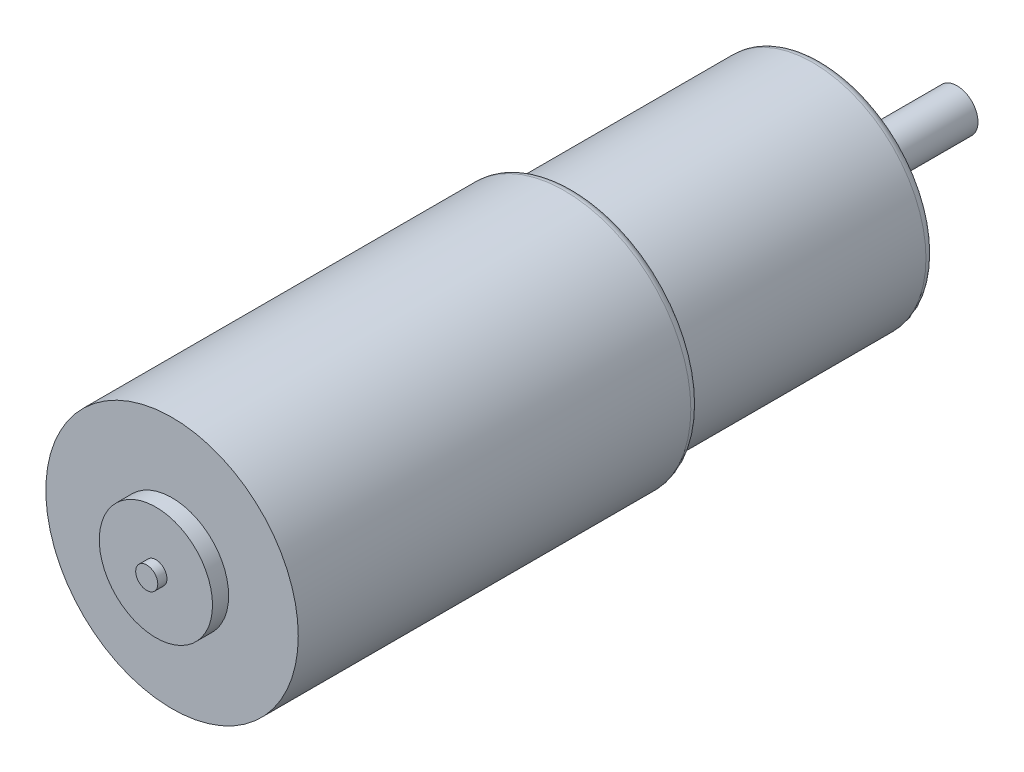
ISO-10303-21;
HEADER;
FILE_DESCRIPTION(('STEP AP214'),'2;1');
FILE_NAME('part.step','',(''),(''),'','','');
FILE_SCHEMA(('AUTOMOTIVE_DESIGN { 1 0 10303 214 1 1 1 1 }'));
ENDSEC;
DATA;
#1=APPLICATION_CONTEXT('core data for automotive mechanical design processes');
#2=APPLICATION_PROTOCOL_DEFINITION('international standard','automotive_design',2000,#1);
#3=PRODUCT_CONTEXT('',#1,'mechanical');
#4=PRODUCT('Part','Part','',(#3));
#5=PRODUCT_RELATED_PRODUCT_CATEGORY('part','',(#4));
#6=PRODUCT_DEFINITION_FORMATION('','',#4);
#7=PRODUCT_DEFINITION_CONTEXT('part definition',#1,'design');
#8=PRODUCT_DEFINITION('design','',#6,#7);
#9=PRODUCT_DEFINITION_SHAPE('','',#8);
#10=(LENGTH_UNIT() NAMED_UNIT(*) SI_UNIT(.MILLI.,.METRE.));
#11=(NAMED_UNIT(*) PLANE_ANGLE_UNIT() SI_UNIT($,.RADIAN.));
#12=(NAMED_UNIT(*) SI_UNIT($,.STERADIAN.) SOLID_ANGLE_UNIT());
#13=UNCERTAINTY_MEASURE_WITH_UNIT(LENGTH_MEASURE(1.E-05),#10,'distance_accuracy_value','');
#14=(GEOMETRIC_REPRESENTATION_CONTEXT(3) GLOBAL_UNCERTAINTY_ASSIGNED_CONTEXT((#13)) GLOBAL_UNIT_ASSIGNED_CONTEXT((#10,
#11,#12)) REPRESENTATION_CONTEXT('',''));
#15=CARTESIAN_POINT('',(0.,0.,0.));
#16=DIRECTION('',(0.,0.,1.));
#17=DIRECTION('',(1.,0.,0.));
#18=AXIS2_PLACEMENT_3D('',#15,#16,#17);
#19=CARTESIAN_POINT('',(0.,0.,-111.125));
#20=DIRECTION('',(0.,0.,1.));
#21=DIRECTION('',(1.,0.,0.));
#22=AXIS2_PLACEMENT_3D('',#19,#20,#21);
#23=PLANE('',#22);
#24=CARTESIAN_POINT('',(0.,0.,-111.125));
#25=DIRECTION('',(0.,0.,1.));
#26=DIRECTION('',(1.,0.,0.));
#27=AXIS2_PLACEMENT_3D('',#24,#25,#26);
#28=CIRCLE('',#27,2.9718);
#29=CARTESIAN_POINT('',(2.9718,0.,-111.125));
#30=VERTEX_POINT('',#29);
#31=EDGE_CURVE('E11',#30,#30,#28,.T.);
#32=ORIENTED_EDGE('',*,*,#31,.F.);
#33=EDGE_LOOP('',(#32));
#34=FACE_BOUND('',#33,.T.);
#35=ADVANCED_FACE('F34',(#34),#23,.F.);
#36=CARTESIAN_POINT('',(0.,0.,3.5814));
#37=DIRECTION('',(0.,0.,1.));
#38=DIRECTION('',(1.,0.,0.));
#39=AXIS2_PLACEMENT_3D('',#36,#37,#38);
#40=CYLINDRICAL_SURFACE('',#39,2.9718);
#41=CARTESIAN_POINT('',(0.,0.,-94.9452));
#42=DIRECTION('',(0.,0.,1.));
#43=DIRECTION('',(1.,0.,0.));
#44=AXIS2_PLACEMENT_3D('',#41,#42,#43);
#45=CIRCLE('',#44,2.9718);
#46=CARTESIAN_POINT('',(2.9718,0.,-94.9452));
#47=VERTEX_POINT('',#46);
#48=EDGE_CURVE('E41',#47,#47,#45,.T.);
#49=ORIENTED_EDGE('',*,*,#48,.F.);
#50=EDGE_LOOP('',(#49));
#51=FACE_BOUND('',#50,.T.);
#52=ORIENTED_EDGE('',*,*,#31,.T.);
#53=EDGE_LOOP('',(#52));
#54=FACE_BOUND('',#53,.T.);
#55=ADVANCED_FACE('F127',(#51,#54),#40,.T.);
#56=CARTESIAN_POINT('',(0.,2.9718,-94.9452));
#57=DIRECTION('',(0.,0.,1.));
#58=DIRECTION('',(1.,0.,0.));
#59=AXIS2_PLACEMENT_3D('',#56,#57,#58);
#60=PLANE('',#59);
#61=CARTESIAN_POINT('',(0.,0.,-94.9452));
#62=DIRECTION('',(0.,0.,1.));
#63=DIRECTION('',(1.,0.,0.));
#64=AXIS2_PLACEMENT_3D('',#61,#62,#63);
#65=CIRCLE('',#64,9.94410000000001);
#66=CARTESIAN_POINT('',(9.94410000000001,0.,-94.9452));
#67=VERTEX_POINT('',#66);
#68=EDGE_CURVE('E120',#67,#67,#65,.T.);
#69=ORIENTED_EDGE('',*,*,#68,.F.);
#70=EDGE_LOOP('',(#69));
#71=FACE_BOUND('',#70,.T.);
#72=ORIENTED_EDGE('',*,*,#48,.T.);
#73=EDGE_LOOP('',(#72));
#74=FACE_BOUND('',#73,.T.);
#75=ADVANCED_FACE('F125',(#71,#74),#60,.F.);
#76=CARTESIAN_POINT('',(0.,0.,3.5814));
#77=DIRECTION('',(0.,0.,1.));
#78=DIRECTION('',(1.,0.,0.));
#79=AXIS2_PLACEMENT_3D('',#76,#77,#78);
#80=CYLINDRICAL_SURFACE('',#79,9.9441);
#81=CARTESIAN_POINT('',(0.,0.,-91.9988));
#82=DIRECTION('',(0.,0.,1.));
#83=DIRECTION('',(1.,0.,0.));
#84=AXIS2_PLACEMENT_3D('',#81,#82,#83);
#85=CIRCLE('',#84,9.9441);
#86=CARTESIAN_POINT('',(9.9441,0.,-91.9988));
#87=VERTEX_POINT('',#86);
#88=EDGE_CURVE('E117',#87,#87,#85,.T.);
#89=ORIENTED_EDGE('',*,*,#88,.F.);
#90=EDGE_LOOP('',(#89));
#91=FACE_BOUND('',#90,.T.);
#92=ORIENTED_EDGE('',*,*,#68,.T.);
#93=EDGE_LOOP('',(#92));
#94=FACE_BOUND('',#93,.T.);
#95=ADVANCED_FACE('F145',(#91,#94),#80,.T.);
#96=CARTESIAN_POINT('',(0.,9.9441,-91.9988));
#97=DIRECTION('',(0.,0.,1.));
#98=DIRECTION('',(1.,0.,0.));
#99=AXIS2_PLACEMENT_3D('',#96,#97,#98);
#100=PLANE('',#99);
#101=CARTESIAN_POINT('',(-9.,9.,-91.9988));
#102=DIRECTION('',(0.,0.,-1.));
#103=DIRECTION('',(-1.,0.,0.));
#104=AXIS2_PLACEMENT_3D('',#101,#102,#103);
#105=CIRCLE('',#104,1.25);
#106=CARTESIAN_POINT('',(-10.25,9.,-91.9988));
#107=VERTEX_POINT('',#106);
#108=EDGE_CURVE('E65',#107,#107,#105,.T.);
#109=ORIENTED_EDGE('',*,*,#108,.F.);
#110=EDGE_LOOP('',(#109));
#111=FACE_BOUND('',#110,.T.);
#112=CARTESIAN_POINT('',(9.,-9.,-91.9988));
#113=DIRECTION('',(0.,0.,-1.));
#114=DIRECTION('',(-1.,0.,0.));
#115=AXIS2_PLACEMENT_3D('',#112,#113,#114);
#116=CIRCLE('',#115,1.25);
#117=CARTESIAN_POINT('',(7.75,-9.,-91.9988));
#118=VERTEX_POINT('',#117);
#119=EDGE_CURVE('E64',#118,#118,#116,.T.);
#120=ORIENTED_EDGE('',*,*,#119,.F.);
#121=EDGE_LOOP('',(#120));
#122=FACE_BOUND('',#121,.T.);
#123=CARTESIAN_POINT('',(9.,9.,-91.9988));
#124=DIRECTION('',(0.,0.,-1.));
#125=DIRECTION('',(-1.,0.,0.));
#126=AXIS2_PLACEMENT_3D('',#123,#124,#125);
#127=CIRCLE('',#126,1.25);
#128=CARTESIAN_POINT('',(7.75,9.,-91.9988));
#129=VERTEX_POINT('',#128);
#130=EDGE_CURVE('E75',#129,#129,#127,.T.);
#131=ORIENTED_EDGE('',*,*,#130,.F.);
#132=EDGE_LOOP('',(#131));
#133=FACE_BOUND('',#132,.T.);
#134=CARTESIAN_POINT('',(-9.,-9.,-91.9988));
#135=DIRECTION('',(0.,0.,-1.));
#136=DIRECTION('',(-1.,0.,0.));
#137=AXIS2_PLACEMENT_3D('',#134,#135,#136);
#138=CIRCLE('',#137,1.25);
#139=CARTESIAN_POINT('',(-10.25,-9.,-91.9988));
#140=VERTEX_POINT('',#139);
#141=EDGE_CURVE('E81',#140,#140,#138,.T.);
#142=ORIENTED_EDGE('',*,*,#141,.F.);
#143=EDGE_LOOP('',(#142));
#144=FACE_BOUND('',#143,.T.);
#145=CARTESIAN_POINT('',(0.,0.,-91.9988));
#146=DIRECTION('',(0.,0.,1.));
#147=DIRECTION('',(1.,0.,0.));
#148=AXIS2_PLACEMENT_3D('',#145,#146,#147);
#149=CIRCLE('',#148,14.732);
#150=CARTESIAN_POINT('',(14.732,0.,-91.9988));
#151=VERTEX_POINT('',#150);
#152=EDGE_CURVE('E114',#151,#151,#149,.T.);
#153=ORIENTED_EDGE('',*,*,#152,.F.);
#154=EDGE_LOOP('',(#153));
#155=FACE_BOUND('',#154,.T.);
#156=ORIENTED_EDGE('',*,*,#88,.T.);
#157=EDGE_LOOP('',(#156));
#158=FACE_BOUND('',#157,.T.);
#159=ADVANCED_FACE('F153',(#111,#122,#133,#144,#155,#158),#100,.F.);
#160=CARTESIAN_POINT('',(0.,0.,-90.7288));
#161=DIRECTION('',(0.,0.,1.));
#162=DIRECTION('',(1.,0.,0.));
#163=AXIS2_PLACEMENT_3D('',#160,#161,#162);
#164=TOROIDAL_SURFACE('',#163,14.732,1.27);
#165=CARTESIAN_POINT('',(0.,0.,-90.7288));
#166=DIRECTION('',(0.,0.,1.));
#167=DIRECTION('',(1.,0.,0.));
#168=AXIS2_PLACEMENT_3D('',#165,#166,#167);
#169=CIRCLE('',#168,16.002);
#170=CARTESIAN_POINT('',(16.002,0.,-90.7288));
#171=VERTEX_POINT('',#170);
#172=EDGE_CURVE('E111',#171,#171,#169,.T.);
#173=ORIENTED_EDGE('',*,*,#172,.F.);
#174=EDGE_LOOP('',(#173));
#175=FACE_BOUND('',#174,.T.);
#176=ORIENTED_EDGE('',*,*,#152,.T.);
#177=EDGE_LOOP('',(#176));
#178=FACE_BOUND('',#177,.T.);
#179=ADVANCED_FACE('F162',(#175,#178),#164,.T.);
#180=CARTESIAN_POINT('',(0.,0.,3.5814));
#181=DIRECTION('',(0.,0.,1.));
#182=DIRECTION('',(1.,0.,0.));
#183=AXIS2_PLACEMENT_3D('',#180,#181,#182);
#184=CYLINDRICAL_SURFACE('',#183,16.002);
#185=CARTESIAN_POINT('',(0.,0.,-56.8452));
#186=DIRECTION('',(0.,0.,1.));
#187=DIRECTION('',(1.,0.,0.));
#188=AXIS2_PLACEMENT_3D('',#185,#186,#187);
#189=CIRCLE('',#188,16.002);
#190=CARTESIAN_POINT('',(16.002,0.,-56.8452));
#191=VERTEX_POINT('',#190);
#192=EDGE_CURVE('E108',#191,#191,#189,.T.);
#193=ORIENTED_EDGE('',*,*,#192,.F.);
#194=EDGE_LOOP('',(#193));
#195=FACE_BOUND('',#194,.T.);
#196=ORIENTED_EDGE('',*,*,#172,.T.);
#197=EDGE_LOOP('',(#196));
#198=FACE_BOUND('',#197,.T.);
#199=ADVANCED_FACE('F171',(#195,#198),#184,.T.);
#200=CARTESIAN_POINT('',(0.,16.002,-56.8452));
#201=DIRECTION('',(0.,0.,1.));
#202=DIRECTION('',(1.,0.,0.));
#203=AXIS2_PLACEMENT_3D('',#200,#201,#202);
#204=PLANE('',#203);
#205=CARTESIAN_POINT('',(0.,0.,-56.8452));
#206=DIRECTION('',(0.,0.,1.));
#207=DIRECTION('',(1.,0.,0.));
#208=AXIS2_PLACEMENT_3D('',#205,#206,#207);
#209=CIRCLE('',#208,16.5989);
#210=CARTESIAN_POINT('',(16.5989,0.,-56.8452));
#211=VERTEX_POINT('',#210);
#212=EDGE_CURVE('E105',#211,#211,#209,.T.);
#213=ORIENTED_EDGE('',*,*,#212,.F.);
#214=EDGE_LOOP('',(#213));
#215=FACE_BOUND('',#214,.T.);
#216=ORIENTED_EDGE('',*,*,#192,.T.);
#217=EDGE_LOOP('',(#216));
#218=FACE_BOUND('',#217,.T.);
#219=ADVANCED_FACE('F179',(#215,#218),#204,.F.);
#220=CARTESIAN_POINT('',(0.,0.,-55.5752));
#221=DIRECTION('',(0.,0.,1.));
#222=DIRECTION('',(1.,0.,0.));
#223=AXIS2_PLACEMENT_3D('',#220,#221,#222);
#224=TOROIDAL_SURFACE('',#223,16.5989,1.27);
#225=CARTESIAN_POINT('',(0.,0.,-55.5752));
#226=DIRECTION('',(0.,0.,1.));
#227=DIRECTION('',(1.,0.,0.));
#228=AXIS2_PLACEMENT_3D('',#225,#226,#227);
#229=CIRCLE('',#228,17.8689);
#230=CARTESIAN_POINT('',(17.8689,0.,-55.5752));
#231=VERTEX_POINT('',#230);
#232=EDGE_CURVE('E102',#231,#231,#229,.T.);
#233=ORIENTED_EDGE('',*,*,#232,.F.);
#234=EDGE_LOOP('',(#233));
#235=FACE_BOUND('',#234,.T.);
#236=ORIENTED_EDGE('',*,*,#212,.T.);
#237=EDGE_LOOP('',(#236));
#238=FACE_BOUND('',#237,.T.);
#239=ADVANCED_FACE('F187',(#235,#238),#224,.T.);
#240=CARTESIAN_POINT('',(0.,0.,3.5814));
#241=DIRECTION('',(0.,0.,1.));
#242=DIRECTION('',(1.,0.,0.));
#243=AXIS2_PLACEMENT_3D('',#240,#241,#242);
#244=CYLINDRICAL_SURFACE('',#243,17.8689);
#245=CARTESIAN_POINT('',(0.,0.,0.));
#246=DIRECTION('',(0.,0.,1.));
#247=DIRECTION('',(1.,0.,0.));
#248=AXIS2_PLACEMENT_3D('',#245,#246,#247);
#249=CIRCLE('',#248,17.8689);
#250=CARTESIAN_POINT('',(17.8689,0.,0.));
#251=VERTEX_POINT('',#250);
#252=EDGE_CURVE('E99',#251,#251,#249,.T.);
#253=ORIENTED_EDGE('',*,*,#252,.F.);
#254=EDGE_LOOP('',(#253));
#255=FACE_BOUND('',#254,.T.);
#256=ORIENTED_EDGE('',*,*,#232,.T.);
#257=EDGE_LOOP('',(#256));
#258=FACE_BOUND('',#257,.T.);
#259=ADVANCED_FACE('F195',(#255,#258),#244,.T.);
#260=CARTESIAN_POINT('',(0.,17.8689,0.));
#261=DIRECTION('',(0.,0.,-1.));
#262=DIRECTION('',(-1.,0.,0.));
#263=AXIS2_PLACEMENT_3D('',#260,#261,#262);
#264=PLANE('',#263);
#265=CARTESIAN_POINT('',(0.,0.,0.));
#266=DIRECTION('',(0.,0.,1.));
#267=DIRECTION('',(1.,0.,0.));
#268=AXIS2_PLACEMENT_3D('',#265,#266,#267);
#269=CIRCLE('',#268,8.0137);
#270=CARTESIAN_POINT('',(8.0137,0.,0.));
#271=VERTEX_POINT('',#270);
#272=EDGE_CURVE('E96',#271,#271,#269,.T.);
#273=ORIENTED_EDGE('',*,*,#272,.F.);
#274=EDGE_LOOP('',(#273));
#275=FACE_BOUND('',#274,.T.);
#276=ORIENTED_EDGE('',*,*,#252,.T.);
#277=EDGE_LOOP('',(#276));
#278=FACE_BOUND('',#277,.T.);
#279=ADVANCED_FACE('F203',(#275,#278),#264,.F.);
#280=CARTESIAN_POINT('',(0.,0.,3.5814));
#281=DIRECTION('',(0.,0.,1.));
#282=DIRECTION('',(1.,0.,0.));
#283=AXIS2_PLACEMENT_3D('',#280,#281,#282);
#284=CYLINDRICAL_SURFACE('',#283,8.0137);
#285=CARTESIAN_POINT('',(0.,0.,2.286));
#286=DIRECTION('',(0.,0.,1.));
#287=DIRECTION('',(1.,0.,0.));
#288=AXIS2_PLACEMENT_3D('',#285,#286,#287);
#289=CIRCLE('',#288,8.0137);
#290=CARTESIAN_POINT('',(8.0137,0.,2.286));
#291=VERTEX_POINT('',#290);
#292=EDGE_CURVE('E93',#291,#291,#289,.T.);
#293=ORIENTED_EDGE('',*,*,#292,.F.);
#294=EDGE_LOOP('',(#293));
#295=FACE_BOUND('',#294,.T.);
#296=ORIENTED_EDGE('',*,*,#272,.T.);
#297=EDGE_LOOP('',(#296));
#298=FACE_BOUND('',#297,.T.);
#299=ADVANCED_FACE('F211',(#295,#298),#284,.T.);
#300=CARTESIAN_POINT('',(0.,8.0137,2.286));
#301=DIRECTION('',(0.,0.,-1.));
#302=DIRECTION('',(-1.,0.,0.));
#303=AXIS2_PLACEMENT_3D('',#300,#301,#302);
#304=PLANE('',#303);
#305=CARTESIAN_POINT('',(0.,0.,2.286));
#306=DIRECTION('',(0.,0.,1.));
#307=DIRECTION('',(1.,0.,0.));
#308=AXIS2_PLACEMENT_3D('',#305,#306,#307);
#309=CIRCLE('',#308,1.5621);
#310=CARTESIAN_POINT('',(1.5621,0.,2.286));
#311=VERTEX_POINT('',#310);
#312=EDGE_CURVE('E90',#311,#311,#309,.T.);
#313=ORIENTED_EDGE('',*,*,#312,.F.);
#314=EDGE_LOOP('',(#313));
#315=FACE_BOUND('',#314,.T.);
#316=ORIENTED_EDGE('',*,*,#292,.T.);
#317=EDGE_LOOP('',(#316));
#318=FACE_BOUND('',#317,.T.);
#319=ADVANCED_FACE('F219',(#315,#318),#304,.F.);
#320=CARTESIAN_POINT('',(0.,0.,3.5814));
#321=DIRECTION('',(0.,0.,1.));
#322=DIRECTION('',(1.,0.,0.));
#323=AXIS2_PLACEMENT_3D('',#320,#321,#322);
#324=CYLINDRICAL_SURFACE('',#323,1.5621);
#325=CARTESIAN_POINT('',(0.,0.,3.5814));
#326=DIRECTION('',(0.,0.,1.));
#327=DIRECTION('',(1.,0.,0.));
#328=AXIS2_PLACEMENT_3D('',#325,#326,#327);
#329=CIRCLE('',#328,1.5621);
#330=CARTESIAN_POINT('',(1.5621,0.,3.5814));
#331=VERTEX_POINT('',#330);
#332=EDGE_CURVE('E87',#331,#331,#329,.T.);
#333=ORIENTED_EDGE('',*,*,#332,.F.);
#334=EDGE_LOOP('',(#333));
#335=FACE_BOUND('',#334,.T.);
#336=ORIENTED_EDGE('',*,*,#312,.T.);
#337=EDGE_LOOP('',(#336));
#338=FACE_BOUND('',#337,.T.);
#339=ADVANCED_FACE('F227',(#335,#338),#324,.T.);
#340=CARTESIAN_POINT('',(0.,1.5621,3.5814));
#341=DIRECTION('',(0.,0.,-1.));
#342=DIRECTION('',(-1.,0.,0.));
#343=AXIS2_PLACEMENT_3D('',#340,#341,#342);
#344=PLANE('',#343);
#345=ORIENTED_EDGE('',*,*,#332,.T.);
#346=EDGE_LOOP('',(#345));
#347=FACE_BOUND('',#346,.T.);
#348=ADVANCED_FACE('F235',(#347),#344,.F.);
#349=CARTESIAN_POINT('',(-9.,-9.,-86.9188));
#350=DIRECTION('',(0.,0.,-1.));
#351=DIRECTION('',(-1.,0.,0.));
#352=AXIS2_PLACEMENT_3D('',#349,#350,#351);
#353=CONICAL_SURFACE('',#352,1.25,1.02974425867666);
#354=CARTESIAN_POINT('',(-9.,-9.,-86.1677242262155));
#355=VERTEX_POINT('',#354);
#356=VERTEX_LOOP('',#355);
#357=FACE_BOUND('',#356,.T.);
#358=CARTESIAN_POINT('',(-9.,-9.,-86.9188));
#359=DIRECTION('',(0.,0.,-1.));
#360=DIRECTION('',(-1.,0.,0.));
#361=AXIS2_PLACEMENT_3D('',#358,#359,#360);
#362=CIRCLE('',#361,1.25);
#363=CARTESIAN_POINT('',(-10.25,-9.,-86.9188));
#364=VERTEX_POINT('',#363);
#365=EDGE_CURVE('E84',#364,#364,#362,.T.);
#366=ORIENTED_EDGE('',*,*,#365,.T.);
#367=EDGE_LOOP('',(#366));
#368=FACE_BOUND('',#367,.T.);
#369=ADVANCED_FACE('F242',(#357,#368),#353,.F.);
#370=CARTESIAN_POINT('',(-9.,-9.,-91.9988));
#371=DIRECTION('',(0.,0.,-1.));
#372=DIRECTION('',(-1.,0.,0.));
#373=AXIS2_PLACEMENT_3D('',#370,#371,#372);
#374=CYLINDRICAL_SURFACE('',#373,1.25);
#375=ORIENTED_EDGE('',*,*,#365,.F.);
#376=EDGE_LOOP('',(#375));
#377=FACE_BOUND('',#376,.T.);
#378=ORIENTED_EDGE('',*,*,#141,.T.);
#379=EDGE_LOOP('',(#378));
#380=FACE_BOUND('',#379,.T.);
#381=ADVANCED_FACE('F249',(#377,#380),#374,.F.);
#382=CARTESIAN_POINT('',(9.,9.,-86.9188));
#383=DIRECTION('',(0.,0.,-1.));
#384=DIRECTION('',(-1.,0.,0.));
#385=AXIS2_PLACEMENT_3D('',#382,#383,#384);
#386=CONICAL_SURFACE('',#385,1.25,1.02974425867666);
#387=CARTESIAN_POINT('',(9.,9.,-86.1677242262155));
#388=VERTEX_POINT('',#387);
#389=VERTEX_LOOP('',#388);
#390=FACE_BOUND('',#389,.T.);
#391=CARTESIAN_POINT('',(9.,9.,-86.9188));
#392=DIRECTION('',(0.,0.,-1.));
#393=DIRECTION('',(-1.,0.,0.));
#394=AXIS2_PLACEMENT_3D('',#391,#392,#393);
#395=CIRCLE('',#394,1.25);
#396=CARTESIAN_POINT('',(7.75,9.,-86.9188));
#397=VERTEX_POINT('',#396);
#398=EDGE_CURVE('E78',#397,#397,#395,.T.);
#399=ORIENTED_EDGE('',*,*,#398,.T.);
#400=EDGE_LOOP('',(#399));
#401=FACE_BOUND('',#400,.T.);
#402=ADVANCED_FACE('F257',(#390,#401),#386,.F.);
#403=CARTESIAN_POINT('',(9.,9.,-91.9988));
#404=DIRECTION('',(0.,0.,-1.));
#405=DIRECTION('',(-1.,0.,0.));
#406=AXIS2_PLACEMENT_3D('',#403,#404,#405);
#407=CYLINDRICAL_SURFACE('',#406,1.25);
#408=ORIENTED_EDGE('',*,*,#398,.F.);
#409=EDGE_LOOP('',(#408));
#410=FACE_BOUND('',#409,.T.);
#411=ORIENTED_EDGE('',*,*,#130,.T.);
#412=EDGE_LOOP('',(#411));
#413=FACE_BOUND('',#412,.T.);
#414=ADVANCED_FACE('F265',(#410,#413),#407,.F.);
#415=CARTESIAN_POINT('',(9.,-9.,-86.9188));
#416=DIRECTION('',(0.,0.,-1.));
#417=DIRECTION('',(-1.,0.,0.));
#418=AXIS2_PLACEMENT_3D('',#415,#416,#417);
#419=CONICAL_SURFACE('',#418,1.25,1.02974425867666);
#420=CARTESIAN_POINT('',(9.,-9.,-86.1677242262155));
#421=VERTEX_POINT('',#420);
#422=VERTEX_LOOP('',#421);
#423=FACE_BOUND('',#422,.T.);
#424=CARTESIAN_POINT('',(9.,-9.,-86.9188));
#425=DIRECTION('',(0.,0.,-1.));
#426=DIRECTION('',(-1.,0.,0.));
#427=AXIS2_PLACEMENT_3D('',#424,#425,#426);
#428=CIRCLE('',#427,1.25);
#429=CARTESIAN_POINT('',(7.75,-9.,-86.9188));
#430=VERTEX_POINT('',#429);
#431=EDGE_CURVE('E68',#430,#430,#428,.T.);
#432=ORIENTED_EDGE('',*,*,#431,.T.);
#433=EDGE_LOOP('',(#432));
#434=FACE_BOUND('',#433,.T.);
#435=ADVANCED_FACE('F272',(#423,#434),#419,.F.);
#436=CARTESIAN_POINT('',(9.,-9.,-91.9988));
#437=DIRECTION('',(0.,0.,-1.));
#438=DIRECTION('',(-1.,0.,0.));
#439=AXIS2_PLACEMENT_3D('',#436,#437,#438);
#440=CYLINDRICAL_SURFACE('',#439,1.25);
#441=ORIENTED_EDGE('',*,*,#431,.F.);
#442=EDGE_LOOP('',(#441));
#443=FACE_BOUND('',#442,.T.);
#444=ORIENTED_EDGE('',*,*,#119,.T.);
#445=EDGE_LOOP('',(#444));
#446=FACE_BOUND('',#445,.T.);
#447=ADVANCED_FACE('F58',(#443,#446),#440,.F.);
#448=CARTESIAN_POINT('',(-9.,9.,-86.9188));
#449=DIRECTION('',(0.,0.,-1.));
#450=DIRECTION('',(-1.,0.,0.));
#451=AXIS2_PLACEMENT_3D('',#448,#449,#450);
#452=CONICAL_SURFACE('',#451,1.25,1.02974425867666);
#453=CARTESIAN_POINT('',(-9.,9.,-86.1677242262155));
#454=VERTEX_POINT('',#453);
#455=VERTEX_LOOP('',#454);
#456=FACE_BOUND('',#455,.T.);
#457=CARTESIAN_POINT('',(-9.,9.,-86.9188));
#458=DIRECTION('',(0.,0.,-1.));
#459=DIRECTION('',(-1.,0.,0.));
#460=AXIS2_PLACEMENT_3D('',#457,#458,#459);
#461=CIRCLE('',#460,1.25);
#462=CARTESIAN_POINT('',(-10.25,9.,-86.9188));
#463=VERTEX_POINT('',#462);
#464=EDGE_CURVE('E62',#463,#463,#461,.T.);
#465=ORIENTED_EDGE('',*,*,#464,.T.);
#466=EDGE_LOOP('',(#465));
#467=FACE_BOUND('',#466,.T.);
#468=ADVANCED_FACE('F54',(#456,#467),#452,.F.);
#469=CARTESIAN_POINT('',(-9.,9.,-91.9988));
#470=DIRECTION('',(0.,0.,-1.));
#471=DIRECTION('',(-1.,0.,0.));
#472=AXIS2_PLACEMENT_3D('',#469,#470,#471);
#473=CYLINDRICAL_SURFACE('',#472,1.25);
#474=ORIENTED_EDGE('',*,*,#464,.F.);
#475=EDGE_LOOP('',(#474));
#476=FACE_BOUND('',#475,.T.);
#477=ORIENTED_EDGE('',*,*,#108,.T.);
#478=EDGE_LOOP('',(#477));
#479=FACE_BOUND('',#478,.T.);
#480=ADVANCED_FACE('F57',(#476,#479),#473,.F.);
#481=CLOSED_SHELL('',(#35,#55,#75,#95,#159,#179,#199,#219,#239,#259,#279,#299,#319,#339,#348,
#369,#381,#402,#414,#435,#447,#468,#480));
#482=MANIFOLD_SOLID_BREP('B2',#481);
#483=ADVANCED_BREP_SHAPE_REPRESENTATION('',(#18,#482),#14);
#484=SHAPE_DEFINITION_REPRESENTATION(#9,#483);
ENDSEC;
END-ISO-10303-21;
